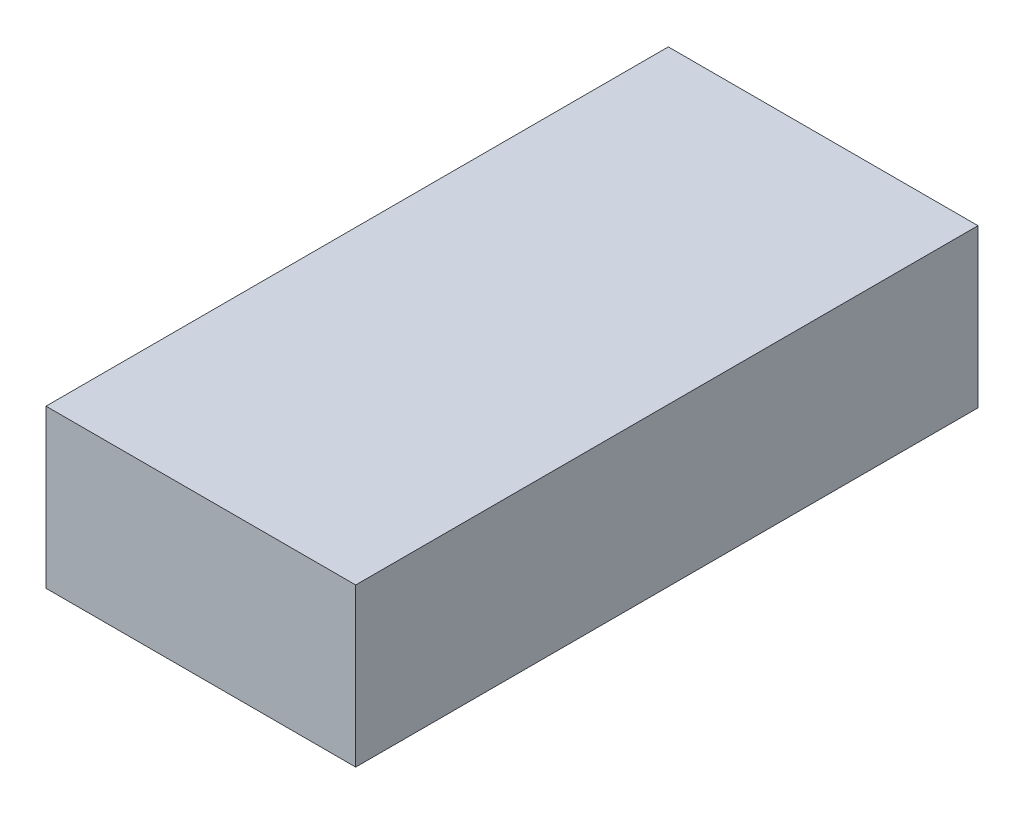
ISO-10303-21;
HEADER;
FILE_DESCRIPTION(('STEP AP214'),'2;1');
FILE_NAME('part.step','',(''),(''),'','','');
FILE_SCHEMA(('AUTOMOTIVE_DESIGN { 1 0 10303 214 1 1 1 1 }'));
ENDSEC;
DATA;
#1=APPLICATION_CONTEXT('core data for automotive mechanical design processes');
#2=APPLICATION_PROTOCOL_DEFINITION('international standard','automotive_design',2000,#1);
#3=PRODUCT_CONTEXT('',#1,'mechanical');
#4=PRODUCT('Part','Part','',(#3));
#5=PRODUCT_RELATED_PRODUCT_CATEGORY('part','',(#4));
#6=PRODUCT_DEFINITION_FORMATION('','',#4);
#7=PRODUCT_DEFINITION_CONTEXT('part definition',#1,'design');
#8=PRODUCT_DEFINITION('design','',#6,#7);
#9=PRODUCT_DEFINITION_SHAPE('','',#8);
#10=(LENGTH_UNIT() NAMED_UNIT(*) SI_UNIT(.MILLI.,.METRE.));
#11=(NAMED_UNIT(*) PLANE_ANGLE_UNIT() SI_UNIT($,.RADIAN.));
#12=(NAMED_UNIT(*) SI_UNIT($,.STERADIAN.) SOLID_ANGLE_UNIT());
#13=UNCERTAINTY_MEASURE_WITH_UNIT(LENGTH_MEASURE(1.E-05),#10,'distance_accuracy_value','');
#14=(GEOMETRIC_REPRESENTATION_CONTEXT(3) GLOBAL_UNCERTAINTY_ASSIGNED_CONTEXT((#13)) GLOBAL_UNIT_ASSIGNED_CONTEXT((#10,
#11,#12)) REPRESENTATION_CONTEXT('',''));
#15=CARTESIAN_POINT('',(0.,0.,0.));
#16=DIRECTION('',(0.,0.,1.));
#17=DIRECTION('',(1.,0.,0.));
#18=AXIS2_PLACEMENT_3D('',#15,#16,#17);
#19=CARTESIAN_POINT('',(53.,54.,-106.5));
#20=DIRECTION('',(-1.,0.,0.));
#21=DIRECTION('',(0.,0.,1.));
#22=AXIS2_PLACEMENT_3D('',#19,#20,#21);
#23=PLANE('',#22);
#24=DIRECTION('',(0.,0.,-1.));
#25=VECTOR('',#24,1.);
#26=CARTESIAN_POINT('',(53.,0.,-106.5));
#27=LINE('',#26,#25);
#28=CARTESIAN_POINT('',(53.,0.,106.5));
#29=VERTEX_POINT('',#28);
#30=CARTESIAN_POINT('',(53.,0.,-106.5));
#31=VERTEX_POINT('',#30);
#32=EDGE_CURVE('E96',#29,#31,#27,.T.);
#33=ORIENTED_EDGE('',*,*,#32,.T.);
#34=DIRECTION('',(0.,-1.,0.));
#35=VECTOR('',#34,1.);
#36=CARTESIAN_POINT('',(53.,54.,-106.5));
#37=LINE('',#36,#35);
#38=CARTESIAN_POINT('',(53.,54.,-106.5));
#39=VERTEX_POINT('',#38);
#40=EDGE_CURVE('E11',#39,#31,#37,.T.);
#41=ORIENTED_EDGE('',*,*,#40,.F.);
#42=DIRECTION('',(0.,0.,-1.));
#43=VECTOR('',#42,1.);
#44=CARTESIAN_POINT('',(53.,54.,-106.5));
#45=LINE('',#44,#43);
#46=CARTESIAN_POINT('',(53.,54.,106.5));
#47=VERTEX_POINT('',#46);
#48=EDGE_CURVE('E84',#47,#39,#45,.T.);
#49=ORIENTED_EDGE('',*,*,#48,.F.);
#50=DIRECTION('',(0.,-1.,0.));
#51=VECTOR('',#50,1.);
#52=CARTESIAN_POINT('',(53.,54.,106.5));
#53=LINE('',#52,#51);
#54=EDGE_CURVE('E92',#47,#29,#53,.T.);
#55=ORIENTED_EDGE('',*,*,#54,.T.);
#56=EDGE_LOOP('',(#33,#41,#49,#55));
#57=FACE_BOUND('',#56,.T.);
#58=ADVANCED_FACE('F33',(#57),#23,.F.);
#59=CARTESIAN_POINT('',(-53.,54.,-106.5));
#60=DIRECTION('',(0.,0.,1.));
#61=DIRECTION('',(1.,0.,0.));
#62=AXIS2_PLACEMENT_3D('',#59,#60,#61);
#63=PLANE('',#62);
#64=DIRECTION('',(-1.,0.,0.));
#65=VECTOR('',#64,1.);
#66=CARTESIAN_POINT('',(-53.,0.,-106.5));
#67=LINE('',#66,#65);
#68=CARTESIAN_POINT('',(-53.,0.,-106.5));
#69=VERTEX_POINT('',#68);
#70=EDGE_CURVE('E88',#31,#69,#67,.T.);
#71=ORIENTED_EDGE('',*,*,#70,.T.);
#72=DIRECTION('',(0.,-1.,0.));
#73=VECTOR('',#72,1.);
#74=CARTESIAN_POINT('',(-53.,54.,-106.5));
#75=LINE('',#74,#73);
#76=CARTESIAN_POINT('',(-53.,54.,-106.5));
#77=VERTEX_POINT('',#76);
#78=EDGE_CURVE('E41',#77,#69,#75,.T.);
#79=ORIENTED_EDGE('',*,*,#78,.F.);
#80=DIRECTION('',(-1.,0.,0.));
#81=VECTOR('',#80,1.);
#82=CARTESIAN_POINT('',(-53.,54.,-106.5));
#83=LINE('',#82,#81);
#84=EDGE_CURVE('E79',#39,#77,#83,.T.);
#85=ORIENTED_EDGE('',*,*,#84,.F.);
#86=ORIENTED_EDGE('',*,*,#40,.T.);
#87=EDGE_LOOP('',(#71,#79,#85,#86));
#88=FACE_BOUND('',#87,.T.);
#89=ADVANCED_FACE('F87',(#88),#63,.F.);
#90=CARTESIAN_POINT('',(-53.,54.,-106.5));
#91=DIRECTION('',(1.,0.,0.));
#92=DIRECTION('',(0.,0.,-1.));
#93=AXIS2_PLACEMENT_3D('',#90,#91,#92);
#94=PLANE('',#93);
#95=DIRECTION('',(0.,0.,1.));
#96=VECTOR('',#95,1.);
#97=CARTESIAN_POINT('',(-53.,0.,-106.5));
#98=LINE('',#97,#96);
#99=CARTESIAN_POINT('',(-53.,0.,106.5));
#100=VERTEX_POINT('',#99);
#101=EDGE_CURVE('E66',#69,#100,#98,.T.);
#102=ORIENTED_EDGE('',*,*,#101,.T.);
#103=DIRECTION('',(0.,-1.,0.));
#104=VECTOR('',#103,1.);
#105=CARTESIAN_POINT('',(-53.,54.,106.5));
#106=LINE('',#105,#104);
#107=CARTESIAN_POINT('',(-53.,54.,106.5));
#108=VERTEX_POINT('',#107);
#109=EDGE_CURVE('E89',#108,#100,#106,.T.);
#110=ORIENTED_EDGE('',*,*,#109,.F.);
#111=DIRECTION('',(0.,0.,1.));
#112=VECTOR('',#111,1.);
#113=CARTESIAN_POINT('',(-53.,54.,-106.5));
#114=LINE('',#113,#112);
#115=EDGE_CURVE('E82',#77,#108,#114,.T.);
#116=ORIENTED_EDGE('',*,*,#115,.F.);
#117=ORIENTED_EDGE('',*,*,#78,.T.);
#118=EDGE_LOOP('',(#102,#110,#116,#117));
#119=FACE_BOUND('',#118,.T.);
#120=ADVANCED_FACE('F90',(#119),#94,.F.);
#121=CARTESIAN_POINT('',(-53.,54.,106.5));
#122=DIRECTION('',(0.,0.,-1.));
#123=DIRECTION('',(-1.,0.,0.));
#124=AXIS2_PLACEMENT_3D('',#121,#122,#123);
#125=PLANE('',#124);
#126=DIRECTION('',(1.,0.,0.));
#127=VECTOR('',#126,1.);
#128=CARTESIAN_POINT('',(-53.,0.,106.5));
#129=LINE('',#128,#127);
#130=EDGE_CURVE('E72',#100,#29,#129,.T.);
#131=ORIENTED_EDGE('',*,*,#130,.T.);
#132=ORIENTED_EDGE('',*,*,#54,.F.);
#133=DIRECTION('',(1.,0.,0.));
#134=VECTOR('',#133,1.);
#135=CARTESIAN_POINT('',(-53.,54.,106.5));
#136=LINE('',#135,#134);
#137=EDGE_CURVE('E49',#108,#47,#136,.T.);
#138=ORIENTED_EDGE('',*,*,#137,.F.);
#139=ORIENTED_EDGE('',*,*,#109,.T.);
#140=EDGE_LOOP('',(#131,#132,#138,#139));
#141=FACE_BOUND('',#140,.T.);
#142=ADVANCED_FACE('F103',(#141),#125,.F.);
#143=CARTESIAN_POINT('',(0.,54.,0.));
#144=DIRECTION('',(0.,1.,0.));
#145=DIRECTION('',(0.,0.,1.));
#146=AXIS2_PLACEMENT_3D('',#143,#144,#145);
#147=PLANE('',#146);
#148=ORIENTED_EDGE('',*,*,#48,.T.);
#149=ORIENTED_EDGE('',*,*,#84,.T.);
#150=ORIENTED_EDGE('',*,*,#115,.T.);
#151=ORIENTED_EDGE('',*,*,#137,.T.);
#152=EDGE_LOOP('',(#148,#149,#150,#151));
#153=FACE_BOUND('',#152,.T.);
#154=ADVANCED_FACE('F80',(#153),#147,.T.);
#155=CARTESIAN_POINT('',(0.,0.,0.));
#156=DIRECTION('',(0.,1.,0.));
#157=DIRECTION('',(0.,0.,1.));
#158=AXIS2_PLACEMENT_3D('',#155,#156,#157);
#159=PLANE('',#158);
#160=ORIENTED_EDGE('',*,*,#32,.F.);
#161=ORIENTED_EDGE('',*,*,#130,.F.);
#162=ORIENTED_EDGE('',*,*,#101,.F.);
#163=ORIENTED_EDGE('',*,*,#70,.F.);
#164=EDGE_LOOP('',(#160,#161,#162,#163));
#165=FACE_BOUND('',#164,.T.);
#166=ADVANCED_FACE('F106',(#165),#159,.F.);
#167=CLOSED_SHELL('',(#58,#89,#120,#142,#154,#166));
#168=MANIFOLD_SOLID_BREP('B2',#167);
#169=ADVANCED_BREP_SHAPE_REPRESENTATION('',(#18,#168),#14);
#170=SHAPE_DEFINITION_REPRESENTATION(#9,#169);
ENDSEC;
END-ISO-10303-21;
